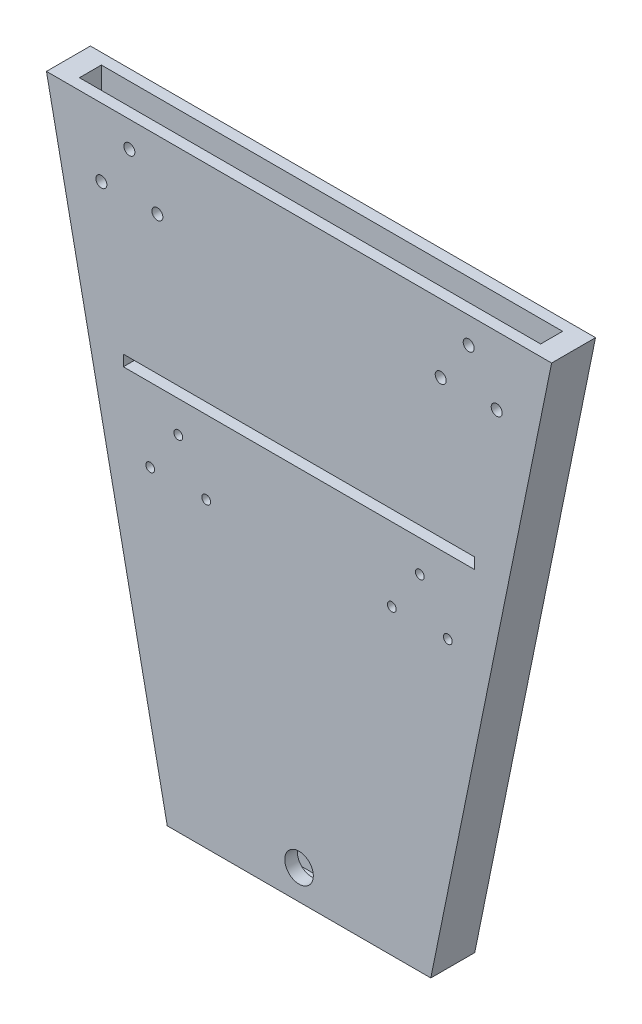
ISO-10303-21;
HEADER;
FILE_DESCRIPTION(('STEP AP214'),'2;1');
FILE_NAME('part.step','',(''),(''),'','','');
FILE_SCHEMA(('AUTOMOTIVE_DESIGN { 1 0 10303 214 1 1 1 1 }'));
ENDSEC;
DATA;
#1=APPLICATION_CONTEXT('core data for automotive mechanical design processes');
#2=APPLICATION_PROTOCOL_DEFINITION('international standard','automotive_design',2000,#1);
#3=PRODUCT_CONTEXT('',#1,'mechanical');
#4=PRODUCT('Part','Part','',(#3));
#5=PRODUCT_RELATED_PRODUCT_CATEGORY('part','',(#4));
#6=PRODUCT_DEFINITION_FORMATION('','',#4);
#7=PRODUCT_DEFINITION_CONTEXT('part definition',#1,'design');
#8=PRODUCT_DEFINITION('design','',#6,#7);
#9=PRODUCT_DEFINITION_SHAPE('','',#8);
#10=(LENGTH_UNIT() NAMED_UNIT(*) SI_UNIT(.MILLI.,.METRE.));
#11=(NAMED_UNIT(*) PLANE_ANGLE_UNIT() SI_UNIT($,.RADIAN.));
#12=(NAMED_UNIT(*) SI_UNIT($,.STERADIAN.) SOLID_ANGLE_UNIT());
#13=UNCERTAINTY_MEASURE_WITH_UNIT(LENGTH_MEASURE(1.E-05),#10,'distance_accuracy_value','');
#14=(GEOMETRIC_REPRESENTATION_CONTEXT(3) GLOBAL_UNCERTAINTY_ASSIGNED_CONTEXT((#13)) GLOBAL_UNIT_ASSIGNED_CONTEXT((#10,
#11,#12)) REPRESENTATION_CONTEXT('',''));
#15=CARTESIAN_POINT('',(0.,0.,0.));
#16=DIRECTION('',(0.,0.,1.));
#17=DIRECTION('',(1.,0.,0.));
#18=AXIS2_PLACEMENT_3D('',#15,#16,#17);
#19=CARTESIAN_POINT('',(0.,-36.49,14.25));
#20=DIRECTION('',(0.,0.,-1.));
#21=DIRECTION('',(-1.,0.,0.));
#22=AXIS2_PLACEMENT_3D('',#19,#20,#21);
#23=CYLINDRICAL_SURFACE('',#22,13.2);
#24=CARTESIAN_POINT('',(0.,-36.49,5.75));
#25=DIRECTION('',(0.,0.,-1.));
#26=DIRECTION('',(-1.,0.,0.));
#27=AXIS2_PLACEMENT_3D('',#24,#25,#26);
#28=CIRCLE('',#27,13.2);
#29=CARTESIAN_POINT('',(0.,-23.29,5.75));
#30=VERTEX_POINT('',#29);
#31=CARTESIAN_POINT('',(0.,-49.69,5.75));
#32=VERTEX_POINT('',#31);
#33=EDGE_CURVE('E155',#30,#32,#28,.T.);
#34=ORIENTED_EDGE('',*,*,#33,.T.);
#35=DIRECTION('',(0.,0.,-1.));
#36=VECTOR('',#35,1.);
#37=CARTESIAN_POINT('',(0.,-49.69,14.25));
#38=LINE('',#37,#36);
#39=CARTESIAN_POINT('',(0.,-49.69,14.25));
#40=VERTEX_POINT('',#39);
#41=EDGE_CURVE('E149',#40,#32,#38,.T.);
#42=ORIENTED_EDGE('',*,*,#41,.F.);
#43=CARTESIAN_POINT('',(0.,-36.49,14.25));
#44=DIRECTION('',(0.,0.,-1.));
#45=DIRECTION('',(-1.,0.,0.));
#46=AXIS2_PLACEMENT_3D('',#43,#44,#45);
#47=CIRCLE('',#46,13.2);
#48=CARTESIAN_POINT('',(0.,-23.29,14.25));
#49=VERTEX_POINT('',#48);
#50=EDGE_CURVE('E152',#49,#40,#47,.T.);
#51=ORIENTED_EDGE('',*,*,#50,.F.);
#52=DIRECTION('',(0.,0.,-1.));
#53=VECTOR('',#52,1.);
#54=CARTESIAN_POINT('',(0.,-23.29,14.25));
#55=LINE('',#54,#53);
#56=EDGE_CURVE('E188',#49,#30,#55,.T.);
#57=ORIENTED_EDGE('',*,*,#56,.T.);
#58=EDGE_LOOP('',(#34,#42,#51,#57));
#59=FACE_BOUND('',#58,.T.);
#60=ADVANCED_FACE('F33',(#59),#23,.F.);
#61=CARTESIAN_POINT('',(0.,-23.29,14.25));
#62=DIRECTION('',(0.,1.,0.));
#63=DIRECTION('',(-1.,0.,0.));
#64=AXIS2_PLACEMENT_3D('',#61,#62,#63);
#65=PLANE('',#64);
#66=DIRECTION('',(1.,0.,0.));
#67=VECTOR('',#66,1.);
#68=CARTESIAN_POINT('',(0.,-23.29,5.75));
#69=LINE('',#68,#67);
#70=CARTESIAN_POINT('',(-11.7815923315927,-23.29,5.75));
#71=VERTEX_POINT('',#70);
#72=EDGE_CURVE('E172',#71,#30,#69,.T.);
#73=ORIENTED_EDGE('',*,*,#72,.T.);
#74=ORIENTED_EDGE('',*,*,#56,.F.);
#75=DIRECTION('',(1.,0.,0.));
#76=VECTOR('',#75,1.);
#77=CARTESIAN_POINT('',(0.,-23.29,14.25));
#78=LINE('',#77,#76);
#79=CARTESIAN_POINT('',(-11.7815923315927,-23.29,14.25));
#80=VERTEX_POINT('',#79);
#81=EDGE_CURVE('E160',#80,#49,#78,.T.);
#82=ORIENTED_EDGE('',*,*,#81,.F.);
#83=DIRECTION('',(0.,0.,-1.));
#84=VECTOR('',#83,1.);
#85=CARTESIAN_POINT('',(-11.7815923315927,-23.29,14.25));
#86=LINE('',#85,#84);
#87=EDGE_CURVE('E191',#80,#71,#86,.T.);
#88=ORIENTED_EDGE('',*,*,#87,.T.);
#89=EDGE_LOOP('',(#73,#74,#82,#88));
#90=FACE_BOUND('',#89,.T.);
#91=ADVANCED_FACE('F369',(#90),#65,.F.);
#92=CARTESIAN_POINT('',(-18.016092171006,-49.69,14.25));
#93=DIRECTION('',(-0.973229983607313,0.229833415776967,0.));
#94=DIRECTION('',(-0.229833415776967,-0.973229983607313,0.));
#95=AXIS2_PLACEMENT_3D('',#92,#93,#94);
#96=PLANE('',#95);
#97=DIRECTION('',(0.229833415776967,0.973229983607313,0.));
#98=VECTOR('',#97,1.);
#99=CARTESIAN_POINT('',(-18.016092171006,-49.69,5.75));
#100=LINE('',#99,#98);
#101=CARTESIAN_POINT('',(-18.016092171006,-49.69,5.75));
#102=VERTEX_POINT('',#101);
#103=EDGE_CURVE('E175',#102,#71,#100,.T.);
#104=ORIENTED_EDGE('',*,*,#103,.T.);
#105=ORIENTED_EDGE('',*,*,#87,.F.);
#106=DIRECTION('',(0.229833415776967,0.973229983607313,0.));
#107=VECTOR('',#106,1.);
#108=CARTESIAN_POINT('',(-18.016092171006,-49.69,14.25));
#109=LINE('',#108,#107);
#110=CARTESIAN_POINT('',(-18.016092171006,-49.69,14.25));
#111=VERTEX_POINT('',#110);
#112=EDGE_CURVE('E168',#111,#80,#109,.T.);
#113=ORIENTED_EDGE('',*,*,#112,.F.);
#114=DIRECTION('',(0.,0.,-1.));
#115=VECTOR('',#114,1.);
#116=CARTESIAN_POINT('',(-18.016092171006,-49.69,14.25));
#117=LINE('',#116,#115);
#118=EDGE_CURVE('E159',#111,#102,#117,.T.);
#119=ORIENTED_EDGE('',*,*,#118,.T.);
#120=EDGE_LOOP('',(#104,#105,#113,#119));
#121=FACE_BOUND('',#120,.T.);
#122=ADVANCED_FACE('F374',(#121),#96,.F.);
#123=CARTESIAN_POINT('',(0.,-49.69,14.25));
#124=DIRECTION('',(0.,-1.,0.));
#125=DIRECTION('',(0.,0.,-1.));
#126=AXIS2_PLACEMENT_3D('',#123,#124,#125);
#127=PLANE('',#126);
#128=DIRECTION('',(-1.,0.,0.));
#129=VECTOR('',#128,1.);
#130=CARTESIAN_POINT('',(0.,-49.69,5.75));
#131=LINE('',#130,#129);
#132=EDGE_CURVE('E184',#32,#102,#131,.T.);
#133=ORIENTED_EDGE('',*,*,#132,.T.);
#134=ORIENTED_EDGE('',*,*,#118,.F.);
#135=DIRECTION('',(-1.,0.,0.));
#136=VECTOR('',#135,1.);
#137=CARTESIAN_POINT('',(0.,-49.69,14.25));
#138=LINE('',#137,#136);
#139=EDGE_CURVE('E163',#40,#111,#138,.T.);
#140=ORIENTED_EDGE('',*,*,#139,.F.);
#141=ORIENTED_EDGE('',*,*,#41,.T.);
#142=EDGE_LOOP('',(#133,#134,#140,#141));
#143=FACE_BOUND('',#142,.T.);
#144=ADVANCED_FACE('F164',(#143),#127,.F.);
#145=CARTESIAN_POINT('',(0.,-36.49,14.25));
#146=DIRECTION('',(0.,0.,-1.));
#147=DIRECTION('',(-1.,0.,0.));
#148=AXIS2_PLACEMENT_3D('',#145,#146,#147);
#149=PLANE('',#148);
#150=CARTESIAN_POINT('',(0.,-36.49,14.25));
#151=DIRECTION('',(0.,0.,-1.));
#152=DIRECTION('',(-1.,0.,0.));
#153=AXIS2_PLACEMENT_3D('',#150,#151,#152);
#154=CIRCLE('',#153,6.5);
#155=CARTESIAN_POINT('',(-6.5,-36.49,14.25));
#156=VERTEX_POINT('',#155);
#157=EDGE_CURVE('E178',#156,#156,#154,.T.);
#158=ORIENTED_EDGE('',*,*,#157,.F.);
#159=EDGE_LOOP('',(#158));
#160=FACE_BOUND('',#159,.T.);
#161=ORIENTED_EDGE('',*,*,#50,.T.);
#162=ORIENTED_EDGE('',*,*,#139,.T.);
#163=ORIENTED_EDGE('',*,*,#112,.T.);
#164=ORIENTED_EDGE('',*,*,#81,.T.);
#165=EDGE_LOOP('',(#161,#162,#163,#164));
#166=FACE_BOUND('',#165,.T.);
#167=ADVANCED_FACE('F170',(#160,#166),#149,.T.);
#168=CARTESIAN_POINT('',(0.,-36.49,5.75));
#169=DIRECTION('',(0.,0.,-1.));
#170=DIRECTION('',(-1.,0.,0.));
#171=AXIS2_PLACEMENT_3D('',#168,#169,#170);
#172=PLANE('',#171);
#173=CARTESIAN_POINT('',(0.,-36.49,5.75));
#174=DIRECTION('',(0.,0.,-1.));
#175=DIRECTION('',(-1.,0.,0.));
#176=AXIS2_PLACEMENT_3D('',#173,#174,#175);
#177=CIRCLE('',#176,6.5);
#178=CARTESIAN_POINT('',(-6.5,-36.49,5.75));
#179=VERTEX_POINT('',#178);
#180=EDGE_CURVE('E37',#179,#179,#177,.T.);
#181=ORIENTED_EDGE('',*,*,#180,.T.);
#182=EDGE_LOOP('',(#181));
#183=FACE_BOUND('',#182,.T.);
#184=ORIENTED_EDGE('',*,*,#33,.F.);
#185=ORIENTED_EDGE('',*,*,#72,.F.);
#186=ORIENTED_EDGE('',*,*,#103,.F.);
#187=ORIENTED_EDGE('',*,*,#132,.F.);
#188=EDGE_LOOP('',(#184,#185,#186,#187));
#189=FACE_BOUND('',#188,.T.);
#190=ADVANCED_FACE('F771',(#183,#189),#172,.F.);
#191=CARTESIAN_POINT('',(0.,0.,5.));
#192=DIRECTION('',(0.,0.,1.));
#193=DIRECTION('',(1.,0.,0.));
#194=AXIS2_PLACEMENT_3D('',#191,#192,#193);
#195=PLANE('',#194);
#196=CARTESIAN_POINT('',(0.,-36.49,5.));
#197=DIRECTION('',(0.,0.,1.));
#198=DIRECTION('',(1.,0.,0.));
#199=AXIS2_PLACEMENT_3D('',#196,#197,#198);
#200=CIRCLE('',#199,6.5);
#201=CARTESIAN_POINT('',(6.5,-36.49,5.));
#202=VERTEX_POINT('',#201);
#203=EDGE_CURVE('E827',#202,#202,#200,.T.);
#204=ORIENTED_EDGE('',*,*,#203,.T.);
#205=EDGE_LOOP('',(#204));
#206=FACE_BOUND('',#205,.T.);
#207=ADVANCED_FACE('F780',(#206),#195,.T.);
#208=CARTESIAN_POINT('',(0.,-36.49,5.));
#209=DIRECTION('',(0.,0.,1.));
#210=DIRECTION('',(1.,0.,0.));
#211=AXIS2_PLACEMENT_3D('',#208,#209,#210);
#212=CYLINDRICAL_SURFACE('',#211,6.5);
#213=ORIENTED_EDGE('',*,*,#203,.F.);
#214=EDGE_LOOP('',(#213));
#215=FACE_BOUND('',#214,.T.);
#216=ORIENTED_EDGE('',*,*,#180,.F.);
#217=EDGE_LOOP('',(#216));
#218=FACE_BOUND('',#217,.T.);
#219=ADVANCED_FACE('F789',(#215,#218),#212,.F.);
#220=ORIENTED_EDGE('',*,*,#157,.T.);
#221=EDGE_LOOP('',(#220));
#222=FACE_BOUND('',#221,.T.);
#223=CARTESIAN_POINT('',(0.,-36.49,20.));
#224=DIRECTION('',(0.,0.,1.));
#225=DIRECTION('',(1.,0.,0.));
#226=AXIS2_PLACEMENT_3D('',#223,#224,#225);
#227=CIRCLE('',#226,6.5);
#228=CARTESIAN_POINT('',(6.5,-36.49,20.));
#229=VERTEX_POINT('',#228);
#230=EDGE_CURVE('E826',#229,#229,#227,.T.);
#231=ORIENTED_EDGE('',*,*,#230,.T.);
#232=EDGE_LOOP('',(#231));
#233=FACE_BOUND('',#232,.T.);
#234=ADVANCED_FACE('F362',(#222,#233),#212,.F.);
#235=CARTESIAN_POINT('',(0.,0.,20.));
#236=DIRECTION('',(0.,0.,1.));
#237=DIRECTION('',(1.,0.,0.));
#238=AXIS2_PLACEMENT_3D('',#235,#236,#237);
#239=PLANE('',#238);
#240=ORIENTED_EDGE('',*,*,#230,.F.);
#241=EDGE_LOOP('',(#240));
#242=FACE_BOUND('',#241,.T.);
#243=CARTESIAN_POINT('',(-67.75,87.51,20.));
#244=DIRECTION('',(0.,0.,1.));
#245=DIRECTION('',(1.,0.,0.));
#246=AXIS2_PLACEMENT_3D('',#243,#244,#245);
#247=CIRCLE('',#246,2.);
#248=CARTESIAN_POINT('',(-65.75,87.51,20.));
#249=VERTEX_POINT('',#248);
#250=EDGE_CURVE('E231',#249,#249,#247,.T.);
#251=ORIENTED_EDGE('',*,*,#250,.F.);
#252=EDGE_LOOP('',(#251));
#253=FACE_BOUND('',#252,.T.);
#254=CARTESIAN_POINT('',(-42.25,87.51,20.));
#255=DIRECTION('',(0.,0.,1.));
#256=DIRECTION('',(1.,0.,0.));
#257=AXIS2_PLACEMENT_3D('',#254,#255,#256);
#258=CIRCLE('',#257,2.);
#259=CARTESIAN_POINT('',(-40.25,87.51,20.));
#260=VERTEX_POINT('',#259);
#261=EDGE_CURVE('E225',#260,#260,#258,.T.);
#262=ORIENTED_EDGE('',*,*,#261,.F.);
#263=EDGE_LOOP('',(#262));
#264=FACE_BOUND('',#263,.T.);
#265=CARTESIAN_POINT('',(-55.,106.652557300424,20.));
#266=DIRECTION('',(0.,0.,1.));
#267=DIRECTION('',(1.,0.,0.));
#268=AXIS2_PLACEMENT_3D('',#265,#266,#267);
#269=CIRCLE('',#268,2.);
#270=CARTESIAN_POINT('',(-53.,106.652557300424,20.));
#271=VERTEX_POINT('',#270);
#272=EDGE_CURVE('E219',#271,#271,#269,.T.);
#273=ORIENTED_EDGE('',*,*,#272,.F.);
#274=EDGE_LOOP('',(#273));
#275=FACE_BOUND('',#274,.T.);
#276=CARTESIAN_POINT('',(90.,189.,20.));
#277=DIRECTION('',(0.,0.,-1.));
#278=DIRECTION('',(-1.,0.,0.));
#279=AXIS2_PLACEMENT_3D('',#276,#277,#278);
#280=CIRCLE('',#279,2.5);
#281=CARTESIAN_POINT('',(87.5,189.,20.));
#282=VERTEX_POINT('',#281);
#283=EDGE_CURVE('E252',#282,#282,#280,.T.);
#284=ORIENTED_EDGE('',*,*,#283,.T.);
#285=EDGE_LOOP('',(#284));
#286=FACE_BOUND('',#285,.T.);
#287=CARTESIAN_POINT('',(55.,106.652557300424,20.));
#288=DIRECTION('',(0.,0.,-1.));
#289=DIRECTION('',(-1.,0.,0.));
#290=AXIS2_PLACEMENT_3D('',#287,#288,#289);
#291=CIRCLE('',#290,2.);
#292=CARTESIAN_POINT('',(53.,106.652557300424,20.));
#293=VERTEX_POINT('',#292);
#294=EDGE_CURVE('E194',#293,#293,#291,.T.);
#295=ORIENTED_EDGE('',*,*,#294,.T.);
#296=EDGE_LOOP('',(#295));
#297=FACE_BOUND('',#296,.T.);
#298=CARTESIAN_POINT('',(67.75,87.51,20.));
#299=DIRECTION('',(0.,0.,-1.));
#300=DIRECTION('',(-1.,0.,0.));
#301=AXIS2_PLACEMENT_3D('',#298,#299,#300);
#302=CIRCLE('',#301,2.);
#303=CARTESIAN_POINT('',(65.75,87.51,20.));
#304=VERTEX_POINT('',#303);
#305=EDGE_CURVE('E207',#304,#304,#302,.T.);
#306=ORIENTED_EDGE('',*,*,#305,.T.);
#307=EDGE_LOOP('',(#306));
#308=FACE_BOUND('',#307,.T.);
#309=CARTESIAN_POINT('',(-77.25,208.142557300424,20.));
#310=DIRECTION('',(0.,0.,1.));
#311=DIRECTION('',(1.,0.,0.));
#312=AXIS2_PLACEMENT_3D('',#309,#310,#311);
#313=CIRCLE('',#312,2.50000000000001);
#314=CARTESIAN_POINT('',(-74.75,208.142557300424,20.));
#315=VERTEX_POINT('',#314);
#316=EDGE_CURVE('E239',#315,#315,#313,.T.);
#317=ORIENTED_EDGE('',*,*,#316,.F.);
#318=EDGE_LOOP('',(#317));
#319=FACE_BOUND('',#318,.T.);
#320=DIRECTION('',(0.199604482144226,-0.979876548708017,0.));
#321=VECTOR('',#320,1.);
#322=CARTESIAN_POINT('',(-115.,220.,20.));
#323=LINE('',#322,#321);
#324=CARTESIAN_POINT('',(-115.,220.,20.));
#325=VERTEX_POINT('',#324);
#326=CARTESIAN_POINT('',(-60.,-50.,20.));
#327=VERTEX_POINT('',#326);
#328=EDGE_CURVE('E320',#325,#327,#323,.T.);
#329=ORIENTED_EDGE('',*,*,#328,.T.);
#330=DIRECTION('',(1.,0.,0.));
#331=VECTOR('',#330,1.);
#332=CARTESIAN_POINT('',(-60.,-50.,20.));
#333=LINE('',#332,#331);
#334=CARTESIAN_POINT('',(60.,-50.,20.));
#335=VERTEX_POINT('',#334);
#336=EDGE_CURVE('E323',#327,#335,#333,.T.);
#337=ORIENTED_EDGE('',*,*,#336,.T.);
#338=DIRECTION('',(0.199604482144226,0.979876548708017,0.));
#339=VECTOR('',#338,1.);
#340=CARTESIAN_POINT('',(115.,220.,20.));
#341=LINE('',#340,#339);
#342=CARTESIAN_POINT('',(115.,220.,20.));
#343=VERTEX_POINT('',#342);
#344=EDGE_CURVE('E326',#335,#343,#341,.T.);
#345=ORIENTED_EDGE('',*,*,#344,.T.);
#346=DIRECTION('',(-1.,0.,0.));
#347=VECTOR('',#346,1.);
#348=CARTESIAN_POINT('',(-115.,220.,20.));
#349=LINE('',#348,#347);
#350=EDGE_CURVE('E328',#343,#325,#349,.T.);
#351=ORIENTED_EDGE('',*,*,#350,.T.);
#352=EDGE_LOOP('',(#329,#337,#345,#351));
#353=FACE_BOUND('',#352,.T.);
#354=DIRECTION('',(1.,0.,0.));
#355=VECTOR('',#354,1.);
#356=CARTESIAN_POINT('',(0.,126.01,20.));
#357=LINE('',#356,#355);
#358=CARTESIAN_POINT('',(-80.0000000000001,126.01,20.));
#359=VERTEX_POINT('',#358);
#360=CARTESIAN_POINT('',(79.9999999999999,126.01,20.));
#361=VERTEX_POINT('',#360);
#362=EDGE_CURVE('E273',#359,#361,#357,.T.);
#363=ORIENTED_EDGE('',*,*,#362,.T.);
#364=DIRECTION('',(0.,-1.,0.));
#365=VECTOR('',#364,1.);
#366=CARTESIAN_POINT('',(79.9999999999999,0.,20.));
#367=LINE('',#366,#365);
#368=CARTESIAN_POINT('',(79.9999999999999,121.01,20.));
#369=VERTEX_POINT('',#368);
#370=EDGE_CURVE('E50',#361,#369,#367,.T.);
#371=ORIENTED_EDGE('',*,*,#370,.T.);
#372=DIRECTION('',(1.,0.,0.));
#373=VECTOR('',#372,1.);
#374=CARTESIAN_POINT('',(0.,121.01,20.));
#375=LINE('',#374,#373);
#376=CARTESIAN_POINT('',(-80.0000000000001,121.01,20.));
#377=VERTEX_POINT('',#376);
#378=EDGE_CURVE('E263',#377,#369,#375,.T.);
#379=ORIENTED_EDGE('',*,*,#378,.F.);
#380=DIRECTION('',(0.,-1.,0.));
#381=VECTOR('',#380,1.);
#382=CARTESIAN_POINT('',(-80.0000000000001,0.,20.));
#383=LINE('',#382,#381);
#384=EDGE_CURVE('E277',#359,#377,#383,.T.);
#385=ORIENTED_EDGE('',*,*,#384,.F.);
#386=EDGE_LOOP('',(#363,#371,#379,#385));
#387=FACE_BOUND('',#386,.T.);
#388=CARTESIAN_POINT('',(42.25,87.51,20.));
#389=DIRECTION('',(0.,0.,-1.));
#390=DIRECTION('',(-1.,0.,0.));
#391=AXIS2_PLACEMENT_3D('',#388,#389,#390);
#392=CIRCLE('',#391,2.);
#393=CARTESIAN_POINT('',(40.25,87.51,20.));
#394=VERTEX_POINT('',#393);
#395=EDGE_CURVE('E201',#394,#394,#392,.T.);
#396=ORIENTED_EDGE('',*,*,#395,.T.);
#397=EDGE_LOOP('',(#396));
#398=FACE_BOUND('',#397,.T.);
#399=CARTESIAN_POINT('',(-64.5,189.,20.));
#400=DIRECTION('',(0.,0.,1.));
#401=DIRECTION('',(1.,0.,0.));
#402=AXIS2_PLACEMENT_3D('',#399,#400,#401);
#403=CIRCLE('',#402,2.5);
#404=CARTESIAN_POINT('',(-62.,189.,20.));
#405=VERTEX_POINT('',#404);
#406=EDGE_CURVE('E236',#405,#405,#403,.T.);
#407=ORIENTED_EDGE('',*,*,#406,.F.);
#408=EDGE_LOOP('',(#407));
#409=FACE_BOUND('',#408,.T.);
#410=CARTESIAN_POINT('',(-90.,189.,20.));
#411=DIRECTION('',(0.,0.,1.));
#412=DIRECTION('',(1.,0.,0.));
#413=AXIS2_PLACEMENT_3D('',#410,#411,#412);
#414=CIRCLE('',#413,2.5);
#415=CARTESIAN_POINT('',(-87.5,189.,20.));
#416=VERTEX_POINT('',#415);
#417=EDGE_CURVE('E243',#416,#416,#414,.T.);
#418=ORIENTED_EDGE('',*,*,#417,.F.);
#419=EDGE_LOOP('',(#418));
#420=FACE_BOUND('',#419,.T.);
#421=CARTESIAN_POINT('',(77.25,208.142557300424,20.));
#422=DIRECTION('',(0.,0.,-1.));
#423=DIRECTION('',(-1.,0.,0.));
#424=AXIS2_PLACEMENT_3D('',#421,#422,#423);
#425=CIRCLE('',#424,2.50000000000001);
#426=CARTESIAN_POINT('',(74.75,208.142557300424,20.));
#427=VERTEX_POINT('',#426);
#428=EDGE_CURVE('E249',#427,#427,#425,.T.);
#429=ORIENTED_EDGE('',*,*,#428,.T.);
#430=EDGE_LOOP('',(#429));
#431=FACE_BOUND('',#430,.T.);
#432=CARTESIAN_POINT('',(64.5,189.,20.));
#433=DIRECTION('',(0.,0.,-1.));
#434=DIRECTION('',(-1.,0.,0.));
#435=AXIS2_PLACEMENT_3D('',#432,#433,#434);
#436=CIRCLE('',#435,2.5);
#437=CARTESIAN_POINT('',(62.,189.,20.));
#438=VERTEX_POINT('',#437);
#439=EDGE_CURVE('E212',#438,#438,#436,.T.);
#440=ORIENTED_EDGE('',*,*,#439,.T.);
#441=EDGE_LOOP('',(#440));
#442=FACE_BOUND('',#441,.T.);
#443=ADVANCED_FACE('F353',(#242,#253,#264,#275,#286,#297,#308,#319,#353,#387,#398,#409,#420,
#431,#442),#239,.T.);
#444=CARTESIAN_POINT('',(-105.,205.,15.));
#445=DIRECTION('',(0.,0.,1.));
#446=DIRECTION('',(1.,0.,0.));
#447=AXIS2_PLACEMENT_3D('',#444,#445,#446);
#448=PLANE('',#447);
#449=CARTESIAN_POINT('',(-77.25,208.142557300424,15.));
#450=DIRECTION('',(0.,0.,1.));
#451=DIRECTION('',(1.,0.,0.));
#452=AXIS2_PLACEMENT_3D('',#449,#450,#451);
#453=CIRCLE('',#452,2.50000000000001);
#454=CARTESIAN_POINT('',(-74.75,208.142557300424,15.));
#455=VERTEX_POINT('',#454);
#456=EDGE_CURVE('E259',#455,#455,#453,.T.);
#457=ORIENTED_EDGE('',*,*,#456,.T.);
#458=EDGE_LOOP('',(#457));
#459=FACE_BOUND('',#458,.T.);
#460=DIRECTION('',(1.,0.,0.));
#461=VECTOR('',#460,1.);
#462=CARTESIAN_POINT('',(-105.,220.,15.));
#463=LINE('',#462,#461);
#464=CARTESIAN_POINT('',(-105.,220.,15.));
#465=VERTEX_POINT('',#464);
#466=CARTESIAN_POINT('',(105.,220.,15.));
#467=VERTEX_POINT('',#466);
#468=EDGE_CURVE('E304',#465,#467,#463,.T.);
#469=ORIENTED_EDGE('',*,*,#468,.T.);
#470=DIRECTION('',(0.,1.,0.));
#471=VECTOR('',#470,1.);
#472=CARTESIAN_POINT('',(105.,205.,15.));
#473=LINE('',#472,#471);
#474=CARTESIAN_POINT('',(105.,205.,15.));
#475=VERTEX_POINT('',#474);
#476=EDGE_CURVE('E317',#475,#467,#473,.T.);
#477=ORIENTED_EDGE('',*,*,#476,.F.);
#478=DIRECTION('',(1.,0.,0.));
#479=VECTOR('',#478,1.);
#480=CARTESIAN_POINT('',(-105.,205.,15.));
#481=LINE('',#480,#479);
#482=CARTESIAN_POINT('',(-105.,205.,15.));
#483=VERTEX_POINT('',#482);
#484=EDGE_CURVE('E292',#483,#475,#481,.T.);
#485=ORIENTED_EDGE('',*,*,#484,.F.);
#486=DIRECTION('',(0.,1.,0.));
#487=VECTOR('',#486,1.);
#488=CARTESIAN_POINT('',(-105.,205.,15.));
#489=LINE('',#488,#487);
#490=EDGE_CURVE('E302',#483,#465,#489,.T.);
#491=ORIENTED_EDGE('',*,*,#490,.T.);
#492=EDGE_LOOP('',(#469,#477,#485,#491));
#493=FACE_BOUND('',#492,.T.);
#494=CARTESIAN_POINT('',(77.25,208.142557300424,15.));
#495=DIRECTION('',(0.,0.,1.));
#496=DIRECTION('',(1.,0.,0.));
#497=AXIS2_PLACEMENT_3D('',#494,#495,#496);
#498=CIRCLE('',#497,2.50000000000001);
#499=CARTESIAN_POINT('',(79.75,208.142557300424,15.));
#500=VERTEX_POINT('',#499);
#501=EDGE_CURVE('E274',#500,#500,#498,.F.);
#502=ORIENTED_EDGE('',*,*,#501,.F.);
#503=EDGE_LOOP('',(#502));
#504=FACE_BOUND('',#503,.T.);
#505=ADVANCED_FACE('F351',(#459,#493,#504),#448,.F.);
#506=CARTESIAN_POINT('',(-115.,220.,20.));
#507=DIRECTION('',(0.979876548708017,0.199604482144226,0.));
#508=DIRECTION('',(-0.199604482144226,0.979876548708017,0.));
#509=AXIS2_PLACEMENT_3D('',#506,#507,#508);
#510=PLANE('',#509);
#511=DIRECTION('',(0.199604482144226,-0.979876548708017,0.));
#512=VECTOR('',#511,1.);
#513=CARTESIAN_POINT('',(-115.,220.,0.));
#514=LINE('',#513,#512);
#515=CARTESIAN_POINT('',(-115.,220.,0.));
#516=VERTEX_POINT('',#515);
#517=CARTESIAN_POINT('',(-60.,-50.,0.));
#518=VERTEX_POINT('',#517);
#519=EDGE_CURVE('E314',#516,#518,#514,.T.);
#520=ORIENTED_EDGE('',*,*,#519,.T.);
#521=DIRECTION('',(0.,0.,-1.));
#522=VECTOR('',#521,1.);
#523=CARTESIAN_POINT('',(-60.,-50.,20.));
#524=LINE('',#523,#522);
#525=EDGE_CURVE('E11',#327,#518,#524,.T.);
#526=ORIENTED_EDGE('',*,*,#525,.F.);
#527=ORIENTED_EDGE('',*,*,#328,.F.);
#528=DIRECTION('',(0.,0.,-1.));
#529=VECTOR('',#528,1.);
#530=CARTESIAN_POINT('',(-115.,220.,20.));
#531=LINE('',#530,#529);
#532=EDGE_CURVE('E330',#325,#516,#531,.T.);
#533=ORIENTED_EDGE('',*,*,#532,.T.);
#534=EDGE_LOOP('',(#520,#526,#527,#533));
#535=FACE_BOUND('',#534,.T.);
#536=ADVANCED_FACE('F35',(#535),#510,.F.);
#537=CARTESIAN_POINT('',(-60.,-50.,20.));
#538=DIRECTION('',(0.,1.,0.));
#539=DIRECTION('',(0.,0.,1.));
#540=AXIS2_PLACEMENT_3D('',#537,#538,#539);
#541=PLANE('',#540);
#542=DIRECTION('',(1.,0.,0.));
#543=VECTOR('',#542,1.);
#544=CARTESIAN_POINT('',(-60.,-50.,0.));
#545=LINE('',#544,#543);
#546=CARTESIAN_POINT('',(60.,-50.,0.));
#547=VERTEX_POINT('',#546);
#548=EDGE_CURVE('E333',#518,#547,#545,.T.);
#549=ORIENTED_EDGE('',*,*,#548,.T.);
#550=DIRECTION('',(0.,0.,-1.));
#551=VECTOR('',#550,1.);
#552=CARTESIAN_POINT('',(60.,-50.,20.));
#553=LINE('',#552,#551);
#554=EDGE_CURVE('E42',#335,#547,#553,.T.);
#555=ORIENTED_EDGE('',*,*,#554,.F.);
#556=ORIENTED_EDGE('',*,*,#336,.F.);
#557=ORIENTED_EDGE('',*,*,#525,.T.);
#558=EDGE_LOOP('',(#549,#555,#556,#557));
#559=FACE_BOUND('',#558,.T.);
#560=ADVANCED_FACE('F360',(#559),#541,.F.);
#561=CARTESIAN_POINT('',(115.,220.,20.));
#562=DIRECTION('',(-0.979876548708017,0.199604482144226,0.));
#563=DIRECTION('',(-0.199604482144226,-0.979876548708017,0.));
#564=AXIS2_PLACEMENT_3D('',#561,#562,#563);
#565=PLANE('',#564);
#566=DIRECTION('',(0.199604482144226,0.979876548708017,0.));
#567=VECTOR('',#566,1.);
#568=CARTESIAN_POINT('',(115.,220.,0.));
#569=LINE('',#568,#567);
#570=CARTESIAN_POINT('',(115.,220.,0.));
#571=VERTEX_POINT('',#570);
#572=EDGE_CURVE('E335',#547,#571,#569,.T.);
#573=ORIENTED_EDGE('',*,*,#572,.T.);
#574=DIRECTION('',(0.,0.,-1.));
#575=VECTOR('',#574,1.);
#576=CARTESIAN_POINT('',(115.,220.,20.));
#577=LINE('',#576,#575);
#578=EDGE_CURVE('E340',#343,#571,#577,.T.);
#579=ORIENTED_EDGE('',*,*,#578,.F.);
#580=ORIENTED_EDGE('',*,*,#344,.F.);
#581=ORIENTED_EDGE('',*,*,#554,.T.);
#582=EDGE_LOOP('',(#573,#579,#580,#581));
#583=FACE_BOUND('',#582,.T.);
#584=ADVANCED_FACE('F519',(#583),#565,.F.);
#585=CARTESIAN_POINT('',(-115.,220.,20.));
#586=DIRECTION('',(0.,-1.,0.));
#587=DIRECTION('',(0.,0.,-1.));
#588=AXIS2_PLACEMENT_3D('',#585,#586,#587);
#589=PLANE('',#588);
#590=ORIENTED_EDGE('',*,*,#468,.F.);
#591=DIRECTION('',(0.,0.,1.));
#592=VECTOR('',#591,1.);
#593=CARTESIAN_POINT('',(-105.,220.,5.));
#594=LINE('',#593,#592);
#595=CARTESIAN_POINT('',(-105.,220.,5.));
#596=VERTEX_POINT('',#595);
#597=EDGE_CURVE('E58',#596,#465,#594,.T.);
#598=ORIENTED_EDGE('',*,*,#597,.F.);
#599=DIRECTION('',(-1.,0.,0.));
#600=VECTOR('',#599,1.);
#601=CARTESIAN_POINT('',(-105.,220.,5.));
#602=LINE('',#601,#600);
#603=CARTESIAN_POINT('',(105.,220.,5.));
#604=VERTEX_POINT('',#603);
#605=EDGE_CURVE('E293',#604,#596,#602,.T.);
#606=ORIENTED_EDGE('',*,*,#605,.F.);
#607=DIRECTION('',(0.,0.,-1.));
#608=VECTOR('',#607,1.);
#609=CARTESIAN_POINT('',(105.,220.,5.));
#610=LINE('',#609,#608);
#611=EDGE_CURVE('E307',#467,#604,#610,.T.);
#612=ORIENTED_EDGE('',*,*,#611,.F.);
#613=EDGE_LOOP('',(#590,#598,#606,#612));
#614=FACE_BOUND('',#613,.T.);
#615=DIRECTION('',(-1.,0.,0.));
#616=VECTOR('',#615,1.);
#617=CARTESIAN_POINT('',(-115.,220.,0.));
#618=LINE('',#617,#616);
#619=EDGE_CURVE('E324',#571,#516,#618,.T.);
#620=ORIENTED_EDGE('',*,*,#619,.T.);
#621=ORIENTED_EDGE('',*,*,#532,.F.);
#622=ORIENTED_EDGE('',*,*,#350,.F.);
#623=ORIENTED_EDGE('',*,*,#578,.T.);
#624=EDGE_LOOP('',(#620,#621,#622,#623));
#625=FACE_BOUND('',#624,.T.);
#626=ADVANCED_FACE('F504',(#614,#625),#589,.F.);
#627=CARTESIAN_POINT('',(0.,0.,0.));
#628=DIRECTION('',(0.,0.,1.));
#629=DIRECTION('',(1.,0.,0.));
#630=AXIS2_PLACEMENT_3D('',#627,#628,#629);
#631=PLANE('',#630);
#632=ORIENTED_EDGE('',*,*,#519,.F.);
#633=ORIENTED_EDGE('',*,*,#619,.F.);
#634=ORIENTED_EDGE('',*,*,#572,.F.);
#635=ORIENTED_EDGE('',*,*,#548,.F.);
#636=EDGE_LOOP('',(#632,#633,#634,#635));
#637=FACE_BOUND('',#636,.T.);
#638=ADVANCED_FACE('F510',(#637),#631,.F.);
#639=CARTESIAN_POINT('',(-105.,205.,5.));
#640=DIRECTION('',(-1.,0.,0.));
#641=DIRECTION('',(0.,0.,1.));
#642=AXIS2_PLACEMENT_3D('',#639,#640,#641);
#643=PLANE('',#642);
#644=ORIENTED_EDGE('',*,*,#597,.T.);
#645=ORIENTED_EDGE('',*,*,#490,.F.);
#646=DIRECTION('',(0.,0.,1.));
#647=VECTOR('',#646,1.);
#648=CARTESIAN_POINT('',(-105.,205.,5.));
#649=LINE('',#648,#647);
#650=CARTESIAN_POINT('',(-105.,205.,5.));
#651=VERTEX_POINT('',#650);
#652=EDGE_CURVE('E289',#651,#483,#649,.T.);
#653=ORIENTED_EDGE('',*,*,#652,.F.);
#654=DIRECTION('',(0.,1.,0.));
#655=VECTOR('',#654,1.);
#656=CARTESIAN_POINT('',(-105.,205.,5.));
#657=LINE('',#656,#655);
#658=EDGE_CURVE('E312',#651,#596,#657,.T.);
#659=ORIENTED_EDGE('',*,*,#658,.T.);
#660=EDGE_LOOP('',(#644,#645,#653,#659));
#661=FACE_BOUND('',#660,.T.);
#662=ADVANCED_FACE('F493',(#661),#643,.F.);
#663=CARTESIAN_POINT('',(-105.,205.,5.));
#664=DIRECTION('',(0.,0.,-1.));
#665=DIRECTION('',(-1.,0.,0.));
#666=AXIS2_PLACEMENT_3D('',#663,#664,#665);
#667=PLANE('',#666);
#668=ORIENTED_EDGE('',*,*,#605,.T.);
#669=ORIENTED_EDGE('',*,*,#658,.F.);
#670=DIRECTION('',(-1.,0.,0.));
#671=VECTOR('',#670,1.);
#672=CARTESIAN_POINT('',(-105.,205.,5.));
#673=LINE('',#672,#671);
#674=CARTESIAN_POINT('',(105.,205.,5.));
#675=VERTEX_POINT('',#674);
#676=EDGE_CURVE('E299',#675,#651,#673,.T.);
#677=ORIENTED_EDGE('',*,*,#676,.F.);
#678=DIRECTION('',(0.,1.,0.));
#679=VECTOR('',#678,1.);
#680=CARTESIAN_POINT('',(105.,205.,5.));
#681=LINE('',#680,#679);
#682=EDGE_CURVE('E315',#675,#604,#681,.T.);
#683=ORIENTED_EDGE('',*,*,#682,.T.);
#684=EDGE_LOOP('',(#668,#669,#677,#683));
#685=FACE_BOUND('',#684,.T.);
#686=ADVANCED_FACE('F491',(#685),#667,.F.);
#687=CARTESIAN_POINT('',(105.,205.,5.));
#688=DIRECTION('',(1.,0.,0.));
#689=DIRECTION('',(0.,0.,-1.));
#690=AXIS2_PLACEMENT_3D('',#687,#688,#689);
#691=PLANE('',#690);
#692=ORIENTED_EDGE('',*,*,#611,.T.);
#693=ORIENTED_EDGE('',*,*,#682,.F.);
#694=DIRECTION('',(0.,0.,-1.));
#695=VECTOR('',#694,1.);
#696=CARTESIAN_POINT('',(105.,205.,5.));
#697=LINE('',#696,#695);
#698=EDGE_CURVE('E296',#475,#675,#697,.T.);
#699=ORIENTED_EDGE('',*,*,#698,.F.);
#700=ORIENTED_EDGE('',*,*,#476,.T.);
#701=EDGE_LOOP('',(#692,#693,#699,#700));
#702=FACE_BOUND('',#701,.T.);
#703=ADVANCED_FACE('F489',(#702),#691,.F.);
#704=CARTESIAN_POINT('',(0.,205.,0.));
#705=DIRECTION('',(0.,1.,0.));
#706=DIRECTION('',(0.,0.,1.));
#707=AXIS2_PLACEMENT_3D('',#704,#705,#706);
#708=PLANE('',#707);
#709=ORIENTED_EDGE('',*,*,#652,.T.);
#710=ORIENTED_EDGE('',*,*,#484,.T.);
#711=ORIENTED_EDGE('',*,*,#698,.T.);
#712=ORIENTED_EDGE('',*,*,#676,.T.);
#713=EDGE_LOOP('',(#709,#710,#711,#712));
#714=FACE_BOUND('',#713,.T.);
#715=ADVANCED_FACE('F486',(#714),#708,.T.);
#716=CARTESIAN_POINT('',(79.9999999999999,0.,10.));
#717=DIRECTION('',(-1.,0.,0.));
#718=DIRECTION('',(0.,0.,1.));
#719=AXIS2_PLACEMENT_3D('',#716,#717,#718);
#720=PLANE('',#719);
#721=ORIENTED_EDGE('',*,*,#370,.F.);
#722=DIRECTION('',(0.,0.,1.));
#723=VECTOR('',#722,1.);
#724=CARTESIAN_POINT('',(79.9999999999999,126.01,10.));
#725=LINE('',#724,#723);
#726=CARTESIAN_POINT('',(79.9999999999999,126.01,10.));
#727=VERTEX_POINT('',#726);
#728=EDGE_CURVE('E271',#727,#361,#725,.T.);
#729=ORIENTED_EDGE('',*,*,#728,.F.);
#730=DIRECTION('',(0.,-1.,0.));
#731=VECTOR('',#730,1.);
#732=CARTESIAN_POINT('',(79.9999999999999,0.,10.));
#733=LINE('',#732,#731);
#734=CARTESIAN_POINT('',(79.9999999999999,121.01,10.));
#735=VERTEX_POINT('',#734);
#736=EDGE_CURVE('E260',#727,#735,#733,.T.);
#737=ORIENTED_EDGE('',*,*,#736,.T.);
#738=DIRECTION('',(0.,0.,1.));
#739=VECTOR('',#738,1.);
#740=CARTESIAN_POINT('',(79.9999999999999,121.01,10.));
#741=LINE('',#740,#739);
#742=EDGE_CURVE('E282',#735,#369,#741,.T.);
#743=ORIENTED_EDGE('',*,*,#742,.T.);
#744=EDGE_LOOP('',(#721,#729,#737,#743));
#745=FACE_BOUND('',#744,.T.);
#746=ADVANCED_FACE('F476',(#745),#720,.T.);
#747=CARTESIAN_POINT('',(0.,121.01,10.));
#748=DIRECTION('',(0.,-1.,0.));
#749=DIRECTION('',(0.,0.,-1.));
#750=AXIS2_PLACEMENT_3D('',#747,#748,#749);
#751=PLANE('',#750);
#752=ORIENTED_EDGE('',*,*,#378,.T.);
#753=ORIENTED_EDGE('',*,*,#742,.F.);
#754=DIRECTION('',(1.,0.,0.));
#755=VECTOR('',#754,1.);
#756=CARTESIAN_POINT('',(0.,121.01,10.));
#757=LINE('',#756,#755);
#758=CARTESIAN_POINT('',(-80.0000000000001,121.01,10.));
#759=VERTEX_POINT('',#758);
#760=EDGE_CURVE('E268',#759,#735,#757,.T.);
#761=ORIENTED_EDGE('',*,*,#760,.F.);
#762=DIRECTION('',(0.,0.,1.));
#763=VECTOR('',#762,1.);
#764=CARTESIAN_POINT('',(-80.0000000000001,121.01,10.));
#765=LINE('',#764,#763);
#766=EDGE_CURVE('E284',#759,#377,#765,.T.);
#767=ORIENTED_EDGE('',*,*,#766,.T.);
#768=EDGE_LOOP('',(#752,#753,#761,#767));
#769=FACE_BOUND('',#768,.T.);
#770=ADVANCED_FACE('F472',(#769),#751,.F.);
#771=CARTESIAN_POINT('',(-80.0000000000001,0.,10.));
#772=DIRECTION('',(-1.,0.,0.));
#773=DIRECTION('',(0.,0.,1.));
#774=AXIS2_PLACEMENT_3D('',#771,#772,#773);
#775=PLANE('',#774);
#776=ORIENTED_EDGE('',*,*,#384,.T.);
#777=ORIENTED_EDGE('',*,*,#766,.F.);
#778=DIRECTION('',(0.,-1.,0.));
#779=VECTOR('',#778,1.);
#780=CARTESIAN_POINT('',(-80.0000000000001,0.,10.));
#781=LINE('',#780,#779);
#782=CARTESIAN_POINT('',(-80.0000000000001,126.01,10.));
#783=VERTEX_POINT('',#782);
#784=EDGE_CURVE('E265',#783,#759,#781,.T.);
#785=ORIENTED_EDGE('',*,*,#784,.F.);
#786=DIRECTION('',(0.,0.,1.));
#787=VECTOR('',#786,1.);
#788=CARTESIAN_POINT('',(-80.0000000000001,126.01,10.));
#789=LINE('',#788,#787);
#790=EDGE_CURVE('E286',#783,#359,#789,.T.);
#791=ORIENTED_EDGE('',*,*,#790,.T.);
#792=EDGE_LOOP('',(#776,#777,#785,#791));
#793=FACE_BOUND('',#792,.T.);
#794=ADVANCED_FACE('F475',(#793),#775,.F.);
#795=CARTESIAN_POINT('',(0.,126.01,10.));
#796=DIRECTION('',(0.,-1.,0.));
#797=DIRECTION('',(0.,0.,-1.));
#798=AXIS2_PLACEMENT_3D('',#795,#796,#797);
#799=PLANE('',#798);
#800=ORIENTED_EDGE('',*,*,#362,.F.);
#801=ORIENTED_EDGE('',*,*,#790,.F.);
#802=DIRECTION('',(1.,0.,0.));
#803=VECTOR('',#802,1.);
#804=CARTESIAN_POINT('',(0.,126.01,10.));
#805=LINE('',#804,#803);
#806=EDGE_CURVE('E262',#783,#727,#805,.T.);
#807=ORIENTED_EDGE('',*,*,#806,.T.);
#808=ORIENTED_EDGE('',*,*,#728,.T.);
#809=EDGE_LOOP('',(#800,#801,#807,#808));
#810=FACE_BOUND('',#809,.T.);
#811=ADVANCED_FACE('F470',(#810),#799,.T.);
#812=CARTESIAN_POINT('',(0.,0.,10.));
#813=DIRECTION('',(0.,0.,1.));
#814=DIRECTION('',(1.,0.,0.));
#815=AXIS2_PLACEMENT_3D('',#812,#813,#814);
#816=PLANE('',#815);
#817=ORIENTED_EDGE('',*,*,#736,.F.);
#818=ORIENTED_EDGE('',*,*,#806,.F.);
#819=ORIENTED_EDGE('',*,*,#784,.T.);
#820=ORIENTED_EDGE('',*,*,#760,.T.);
#821=EDGE_LOOP('',(#817,#818,#819,#820));
#822=FACE_BOUND('',#821,.T.);
#823=ADVANCED_FACE('F466',(#822),#816,.T.);
#824=CARTESIAN_POINT('',(-77.25,208.142557300424,10.));
#825=DIRECTION('',(0.,0.,1.));
#826=DIRECTION('',(1.,0.,0.));
#827=AXIS2_PLACEMENT_3D('',#824,#825,#826);
#828=CYLINDRICAL_SURFACE('',#827,2.50000000000001);
#829=ORIENTED_EDGE('',*,*,#316,.T.);
#830=EDGE_LOOP('',(#829));
#831=FACE_BOUND('',#830,.T.);
#832=ORIENTED_EDGE('',*,*,#456,.F.);
#833=EDGE_LOOP('',(#832));
#834=FACE_BOUND('',#833,.T.);
#835=ADVANCED_FACE('F456',(#831,#834),#828,.F.);
#836=CARTESIAN_POINT('',(77.25,208.142557300424,10.));
#837=DIRECTION('',(0.,0.,1.));
#838=DIRECTION('',(1.,0.,0.));
#839=AXIS2_PLACEMENT_3D('',#836,#837,#838);
#840=CYLINDRICAL_SURFACE('',#839,2.50000000000001);
#841=ORIENTED_EDGE('',*,*,#428,.F.);
#842=EDGE_LOOP('',(#841));
#843=FACE_BOUND('',#842,.T.);
#844=ORIENTED_EDGE('',*,*,#501,.T.);
#845=EDGE_LOOP('',(#844));
#846=FACE_BOUND('',#845,.T.);
#847=ADVANCED_FACE('F349',(#843,#846),#840,.F.);
#848=CARTESIAN_POINT('',(67.75,87.51,10.));
#849=DIRECTION('',(0.,0.,1.));
#850=DIRECTION('',(1.,0.,0.));
#851=AXIS2_PLACEMENT_3D('',#848,#849,#850);
#852=CYLINDRICAL_SURFACE('',#851,2.);
#853=CARTESIAN_POINT('',(67.75,87.51,10.));
#854=DIRECTION('',(0.,0.,-1.));
#855=DIRECTION('',(-1.,0.,0.));
#856=AXIS2_PLACEMENT_3D('',#853,#854,#855);
#857=CIRCLE('',#856,2.);
#858=CARTESIAN_POINT('',(65.75,87.51,10.));
#859=VERTEX_POINT('',#858);
#860=EDGE_CURVE('E190',#859,#859,#857,.T.);
#861=ORIENTED_EDGE('',*,*,#860,.T.);
#862=EDGE_LOOP('',(#861));
#863=FACE_BOUND('',#862,.T.);
#864=ORIENTED_EDGE('',*,*,#305,.F.);
#865=EDGE_LOOP('',(#864));
#866=FACE_BOUND('',#865,.T.);
#867=ADVANCED_FACE('F398',(#863,#866),#852,.F.);
#868=CARTESIAN_POINT('',(67.75,87.51,10.));
#869=DIRECTION('',(0.,0.,-1.));
#870=DIRECTION('',(-1.,0.,0.));
#871=AXIS2_PLACEMENT_3D('',#868,#869,#870);
#872=PLANE('',#871);
#873=ORIENTED_EDGE('',*,*,#860,.F.);
#874=EDGE_LOOP('',(#873));
#875=FACE_BOUND('',#874,.T.);
#876=ADVANCED_FACE('F393',(#875),#872,.F.);
#877=CARTESIAN_POINT('',(42.25,87.51,10.));
#878=DIRECTION('',(0.,0.,1.));
#879=DIRECTION('',(1.,0.,0.));
#880=AXIS2_PLACEMENT_3D('',#877,#878,#879);
#881=CYLINDRICAL_SURFACE('',#880,2.);
#882=CARTESIAN_POINT('',(42.25,87.51,10.));
#883=DIRECTION('',(0.,0.,-1.));
#884=DIRECTION('',(-1.,0.,0.));
#885=AXIS2_PLACEMENT_3D('',#882,#883,#884);
#886=CIRCLE('',#885,2.);
#887=CARTESIAN_POINT('',(40.25,87.51,10.));
#888=VERTEX_POINT('',#887);
#889=EDGE_CURVE('E204',#888,#888,#886,.T.);
#890=ORIENTED_EDGE('',*,*,#889,.T.);
#891=EDGE_LOOP('',(#890));
#892=FACE_BOUND('',#891,.T.);
#893=ORIENTED_EDGE('',*,*,#395,.F.);
#894=EDGE_LOOP('',(#893));
#895=FACE_BOUND('',#894,.T.);
#896=ADVANCED_FACE('F390',(#892,#895),#881,.F.);
#897=CARTESIAN_POINT('',(42.25,87.51,10.));
#898=DIRECTION('',(0.,0.,-1.));
#899=DIRECTION('',(-1.,0.,0.));
#900=AXIS2_PLACEMENT_3D('',#897,#898,#899);
#901=PLANE('',#900);
#902=ORIENTED_EDGE('',*,*,#889,.F.);
#903=EDGE_LOOP('',(#902));
#904=FACE_BOUND('',#903,.T.);
#905=ADVANCED_FACE('F384',(#904),#901,.F.);
#906=CARTESIAN_POINT('',(55.,106.652557300424,10.));
#907=DIRECTION('',(0.,0.,1.));
#908=DIRECTION('',(1.,0.,0.));
#909=AXIS2_PLACEMENT_3D('',#906,#907,#908);
#910=CYLINDRICAL_SURFACE('',#909,2.);
#911=CARTESIAN_POINT('',(55.,106.652557300424,10.));
#912=DIRECTION('',(0.,0.,-1.));
#913=DIRECTION('',(-1.,0.,0.));
#914=AXIS2_PLACEMENT_3D('',#911,#912,#913);
#915=CIRCLE('',#914,2.);
#916=CARTESIAN_POINT('',(53.,106.652557300424,10.));
#917=VERTEX_POINT('',#916);
#918=EDGE_CURVE('E198',#917,#917,#915,.T.);
#919=ORIENTED_EDGE('',*,*,#918,.T.);
#920=EDGE_LOOP('',(#919));
#921=FACE_BOUND('',#920,.T.);
#922=ORIENTED_EDGE('',*,*,#294,.F.);
#923=EDGE_LOOP('',(#922));
#924=FACE_BOUND('',#923,.T.);
#925=ADVANCED_FACE('F380',(#921,#924),#910,.F.);
#926=CARTESIAN_POINT('',(55.,106.652557300424,10.));
#927=DIRECTION('',(0.,0.,-1.));
#928=DIRECTION('',(-1.,0.,0.));
#929=AXIS2_PLACEMENT_3D('',#926,#927,#928);
#930=PLANE('',#929);
#931=ORIENTED_EDGE('',*,*,#918,.F.);
#932=EDGE_LOOP('',(#931));
#933=FACE_BOUND('',#932,.T.);
#934=ADVANCED_FACE('F383',(#933),#930,.F.);
#935=CARTESIAN_POINT('',(-64.5,189.,10.));
#936=DIRECTION('',(0.,0.,1.));
#937=DIRECTION('',(1.,0.,0.));
#938=AXIS2_PLACEMENT_3D('',#935,#936,#937);
#939=CYLINDRICAL_SURFACE('',#938,2.5);
#940=CARTESIAN_POINT('',(-64.5,189.,10.));
#941=DIRECTION('',(0.,0.,1.));
#942=DIRECTION('',(1.,0.,0.));
#943=AXIS2_PLACEMENT_3D('',#940,#941,#942);
#944=CIRCLE('',#943,2.5);
#945=CARTESIAN_POINT('',(-62.,189.,10.));
#946=VERTEX_POINT('',#945);
#947=EDGE_CURVE('E240',#946,#946,#944,.T.);
#948=ORIENTED_EDGE('',*,*,#947,.F.);
#949=EDGE_LOOP('',(#948));
#950=FACE_BOUND('',#949,.T.);
#951=ORIENTED_EDGE('',*,*,#406,.T.);
#952=EDGE_LOOP('',(#951));
#953=FACE_BOUND('',#952,.T.);
#954=ADVANCED_FACE('F388',(#950,#953),#939,.F.);
#955=CARTESIAN_POINT('',(-64.5,189.,10.));
#956=DIRECTION('',(0.,0.,1.));
#957=DIRECTION('',(1.,0.,0.));
#958=AXIS2_PLACEMENT_3D('',#955,#956,#957);
#959=PLANE('',#958);
#960=ORIENTED_EDGE('',*,*,#947,.T.);
#961=EDGE_LOOP('',(#960));
#962=FACE_BOUND('',#961,.T.);
#963=ADVANCED_FACE('F440',(#962),#959,.T.);
#964=CARTESIAN_POINT('',(-90.,189.,10.));
#965=DIRECTION('',(0.,0.,1.));
#966=DIRECTION('',(1.,0.,0.));
#967=AXIS2_PLACEMENT_3D('',#964,#965,#966);
#968=CYLINDRICAL_SURFACE('',#967,2.5);
#969=CARTESIAN_POINT('',(-90.,189.,10.));
#970=DIRECTION('',(0.,0.,1.));
#971=DIRECTION('',(1.,0.,0.));
#972=AXIS2_PLACEMENT_3D('',#969,#970,#971);
#973=CIRCLE('',#972,2.5);
#974=CARTESIAN_POINT('',(-87.5,189.,10.));
#975=VERTEX_POINT('',#974);
#976=EDGE_CURVE('E246',#975,#975,#973,.T.);
#977=ORIENTED_EDGE('',*,*,#976,.F.);
#978=EDGE_LOOP('',(#977));
#979=FACE_BOUND('',#978,.T.);
#980=ORIENTED_EDGE('',*,*,#417,.T.);
#981=EDGE_LOOP('',(#980));
#982=FACE_BOUND('',#981,.T.);
#983=ADVANCED_FACE('F444',(#979,#982),#968,.F.);
#984=CARTESIAN_POINT('',(-90.,189.,10.));
#985=DIRECTION('',(0.,0.,1.));
#986=DIRECTION('',(1.,0.,0.));
#987=AXIS2_PLACEMENT_3D('',#984,#985,#986);
#988=PLANE('',#987);
#989=ORIENTED_EDGE('',*,*,#976,.T.);
#990=EDGE_LOOP('',(#989));
#991=FACE_BOUND('',#990,.T.);
#992=ADVANCED_FACE('F448',(#991),#988,.T.);
#993=CARTESIAN_POINT('',(90.,189.,10.));
#994=DIRECTION('',(0.,0.,1.));
#995=DIRECTION('',(1.,0.,0.));
#996=AXIS2_PLACEMENT_3D('',#993,#994,#995);
#997=CYLINDRICAL_SURFACE('',#996,2.5);
#998=CARTESIAN_POINT('',(90.,189.,10.));
#999=DIRECTION('',(0.,0.,-1.));
#1000=DIRECTION('',(-1.,0.,0.));
#1001=AXIS2_PLACEMENT_3D('',#998,#999,#1000);
#1002=CIRCLE('',#1001,2.5);
#1003=CARTESIAN_POINT('',(87.5,189.,10.));
#1004=VERTEX_POINT('',#1003);
#1005=EDGE_CURVE('E215',#1004,#1004,#1002,.T.);
#1006=ORIENTED_EDGE('',*,*,#1005,.T.);
#1007=EDGE_LOOP('',(#1006));
#1008=FACE_BOUND('',#1007,.T.);
#1009=ORIENTED_EDGE('',*,*,#283,.F.);
#1010=EDGE_LOOP('',(#1009));
#1011=FACE_BOUND('',#1010,.T.);
#1012=ADVANCED_FACE('F452',(#1008,#1011),#997,.F.);
#1013=CARTESIAN_POINT('',(90.,189.,10.));
#1014=DIRECTION('',(0.,0.,-1.));
#1015=DIRECTION('',(-1.,0.,0.));
#1016=AXIS2_PLACEMENT_3D('',#1013,#1014,#1015);
#1017=PLANE('',#1016);
#1018=ORIENTED_EDGE('',*,*,#1005,.F.);
#1019=EDGE_LOOP('',(#1018));
#1020=FACE_BOUND('',#1019,.T.);
#1021=ADVANCED_FACE('F409',(#1020),#1017,.F.);
#1022=CARTESIAN_POINT('',(64.5,189.,10.));
#1023=DIRECTION('',(0.,0.,1.));
#1024=DIRECTION('',(1.,0.,0.));
#1025=AXIS2_PLACEMENT_3D('',#1022,#1023,#1024);
#1026=CYLINDRICAL_SURFACE('',#1025,2.5);
#1027=CARTESIAN_POINT('',(64.5,189.,10.));
#1028=DIRECTION('',(0.,0.,-1.));
#1029=DIRECTION('',(-1.,0.,0.));
#1030=AXIS2_PLACEMENT_3D('',#1027,#1028,#1029);
#1031=CIRCLE('',#1030,2.5);
#1032=CARTESIAN_POINT('',(62.,189.,10.));
#1033=VERTEX_POINT('',#1032);
#1034=EDGE_CURVE('E216',#1033,#1033,#1031,.T.);
#1035=ORIENTED_EDGE('',*,*,#1034,.T.);
#1036=EDGE_LOOP('',(#1035));
#1037=FACE_BOUND('',#1036,.T.);
#1038=ORIENTED_EDGE('',*,*,#439,.F.);
#1039=EDGE_LOOP('',(#1038));
#1040=FACE_BOUND('',#1039,.T.);
#1041=ADVANCED_FACE('F405',(#1037,#1040),#1026,.F.);
#1042=CARTESIAN_POINT('',(64.5,189.,10.));
#1043=DIRECTION('',(0.,0.,-1.));
#1044=DIRECTION('',(-1.,0.,0.));
#1045=AXIS2_PLACEMENT_3D('',#1042,#1043,#1044);
#1046=PLANE('',#1045);
#1047=ORIENTED_EDGE('',*,*,#1034,.F.);
#1048=EDGE_LOOP('',(#1047));
#1049=FACE_BOUND('',#1048,.T.);
#1050=ADVANCED_FACE('F408',(#1049),#1046,.F.);
#1051=CARTESIAN_POINT('',(-55.,106.652557300424,10.));
#1052=DIRECTION('',(0.,0.,1.));
#1053=DIRECTION('',(1.,0.,0.));
#1054=AXIS2_PLACEMENT_3D('',#1051,#1052,#1053);
#1055=CYLINDRICAL_SURFACE('',#1054,2.);
#1056=CARTESIAN_POINT('',(-55.,106.652557300424,10.));
#1057=DIRECTION('',(0.,0.,1.));
#1058=DIRECTION('',(1.,0.,0.));
#1059=AXIS2_PLACEMENT_3D('',#1056,#1057,#1058);
#1060=CIRCLE('',#1059,2.);
#1061=CARTESIAN_POINT('',(-53.,106.652557300424,10.));
#1062=VERTEX_POINT('',#1061);
#1063=EDGE_CURVE('E222',#1062,#1062,#1060,.T.);
#1064=ORIENTED_EDGE('',*,*,#1063,.F.);
#1065=EDGE_LOOP('',(#1064));
#1066=FACE_BOUND('',#1065,.T.);
#1067=ORIENTED_EDGE('',*,*,#272,.T.);
#1068=EDGE_LOOP('',(#1067));
#1069=FACE_BOUND('',#1068,.T.);
#1070=ADVANCED_FACE('F413',(#1066,#1069),#1055,.F.);
#1071=CARTESIAN_POINT('',(-55.,106.652557300424,10.));
#1072=DIRECTION('',(0.,0.,1.));
#1073=DIRECTION('',(1.,0.,0.));
#1074=AXIS2_PLACEMENT_3D('',#1071,#1072,#1073);
#1075=PLANE('',#1074);
#1076=ORIENTED_EDGE('',*,*,#1063,.T.);
#1077=EDGE_LOOP('',(#1076));
#1078=FACE_BOUND('',#1077,.T.);
#1079=ADVANCED_FACE('F417',(#1078),#1075,.T.);
#1080=CARTESIAN_POINT('',(-42.25,87.51,10.));
#1081=DIRECTION('',(0.,0.,1.));
#1082=DIRECTION('',(1.,0.,0.));
#1083=AXIS2_PLACEMENT_3D('',#1080,#1081,#1082);
#1084=CYLINDRICAL_SURFACE('',#1083,2.);
#1085=CARTESIAN_POINT('',(-42.25,87.51,10.));
#1086=DIRECTION('',(0.,0.,1.));
#1087=DIRECTION('',(1.,0.,0.));
#1088=AXIS2_PLACEMENT_3D('',#1085,#1086,#1087);
#1089=CIRCLE('',#1088,2.);
#1090=CARTESIAN_POINT('',(-40.25,87.51,10.));
#1091=VERTEX_POINT('',#1090);
#1092=EDGE_CURVE('E228',#1091,#1091,#1089,.T.);
#1093=ORIENTED_EDGE('',*,*,#1092,.F.);
#1094=EDGE_LOOP('',(#1093));
#1095=FACE_BOUND('',#1094,.T.);
#1096=ORIENTED_EDGE('',*,*,#261,.T.);
#1097=EDGE_LOOP('',(#1096));
#1098=FACE_BOUND('',#1097,.T.);
#1099=ADVANCED_FACE('F421',(#1095,#1098),#1084,.F.);
#1100=CARTESIAN_POINT('',(-42.25,87.51,10.));
#1101=DIRECTION('',(0.,0.,1.));
#1102=DIRECTION('',(1.,0.,0.));
#1103=AXIS2_PLACEMENT_3D('',#1100,#1101,#1102);
#1104=PLANE('',#1103);
#1105=ORIENTED_EDGE('',*,*,#1092,.T.);
#1106=EDGE_LOOP('',(#1105));
#1107=FACE_BOUND('',#1106,.T.);
#1108=ADVANCED_FACE('F425',(#1107),#1104,.T.);
#1109=CARTESIAN_POINT('',(-67.75,87.51,10.));
#1110=DIRECTION('',(0.,0.,1.));
#1111=DIRECTION('',(1.,0.,0.));
#1112=AXIS2_PLACEMENT_3D('',#1109,#1110,#1111);
#1113=CYLINDRICAL_SURFACE('',#1112,2.);
#1114=CARTESIAN_POINT('',(-67.75,87.51,10.));
#1115=DIRECTION('',(0.,0.,1.));
#1116=DIRECTION('',(1.,0.,0.));
#1117=AXIS2_PLACEMENT_3D('',#1114,#1115,#1116);
#1118=CIRCLE('',#1117,2.);
#1119=CARTESIAN_POINT('',(-65.75,87.51,10.));
#1120=VERTEX_POINT('',#1119);
#1121=EDGE_CURVE('E197',#1120,#1120,#1118,.T.);
#1122=ORIENTED_EDGE('',*,*,#1121,.F.);
#1123=EDGE_LOOP('',(#1122));
#1124=FACE_BOUND('',#1123,.T.);
#1125=ORIENTED_EDGE('',*,*,#250,.T.);
#1126=EDGE_LOOP('',(#1125));
#1127=FACE_BOUND('',#1126,.T.);
#1128=ADVANCED_FACE('F429',(#1124,#1127),#1113,.F.);
#1129=CARTESIAN_POINT('',(-67.75,87.51,10.));
#1130=DIRECTION('',(0.,0.,1.));
#1131=DIRECTION('',(1.,0.,0.));
#1132=AXIS2_PLACEMENT_3D('',#1129,#1130,#1131);
#1133=PLANE('',#1132);
#1134=ORIENTED_EDGE('',*,*,#1121,.T.);
#1135=EDGE_LOOP('',(#1134));
#1136=FACE_BOUND('',#1135,.T.);
#1137=ADVANCED_FACE('F433',(#1136),#1133,.T.);
#1138=CLOSED_SHELL('',(#60,#91,#122,#144,#167,#190,#207,#219,#234,#443,#505,#536,#560,#584,#626,
#638,#662,#686,#703,#715,#746,#770,#794,#811,#823,#835,#847,#867,#876,#896,#905,#925,#934,#954,
#963,#983,#992,#1012,#1021,#1041,#1050,#1070,#1079,#1099,#1108,#1128,#1137));
#1139=MANIFOLD_SOLID_BREP('B2',#1138);
#1140=ADVANCED_BREP_SHAPE_REPRESENTATION('',(#18,#1139),#14);
#1141=SHAPE_DEFINITION_REPRESENTATION(#9,#1140);
ENDSEC;
END-ISO-10303-21;
